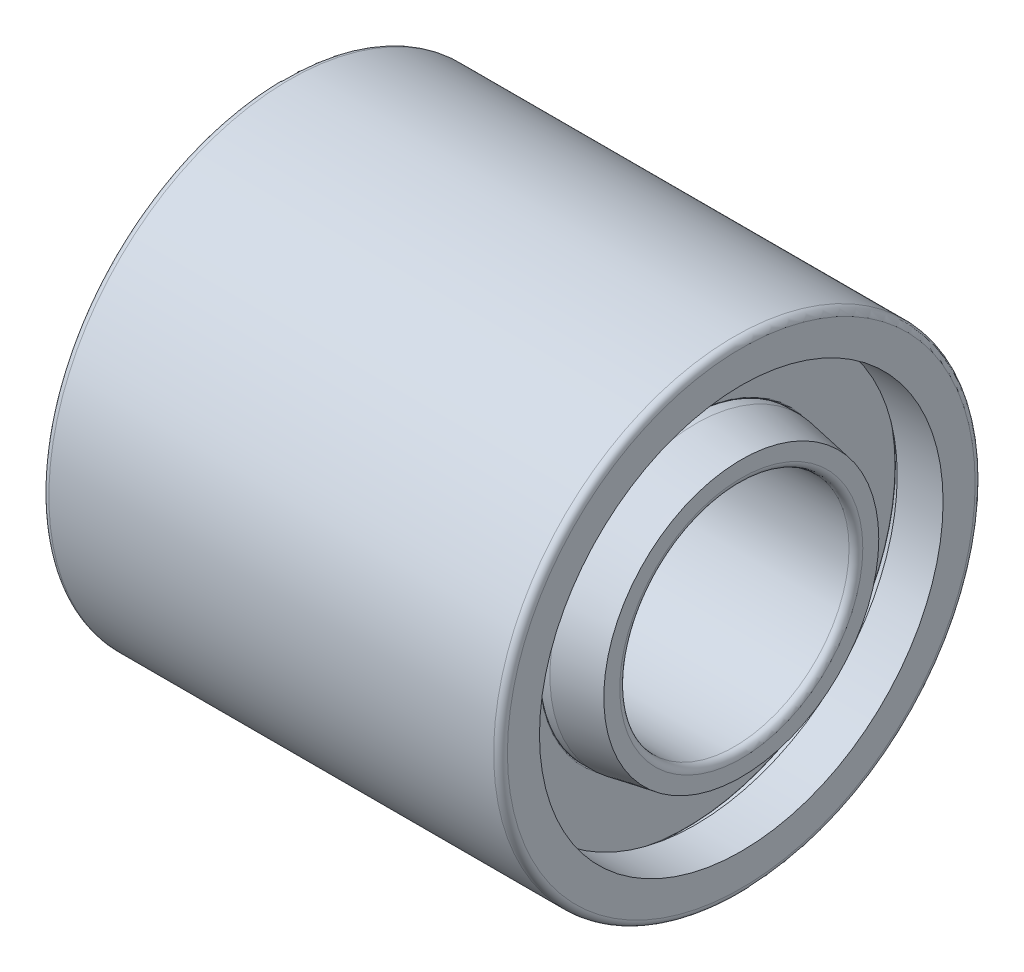
ISO-10303-21;
HEADER;
FILE_DESCRIPTION(('STEP AP214'),'2;1');
FILE_NAME('part.step','',(''),(''),'','','');
FILE_SCHEMA(('AUTOMOTIVE_DESIGN { 1 0 10303 214 1 1 1 1 }'));
ENDSEC;
DATA;
#1=APPLICATION_CONTEXT('core data for automotive mechanical design processes');
#2=APPLICATION_PROTOCOL_DEFINITION('international standard','automotive_design',2000,#1);
#3=PRODUCT_CONTEXT('',#1,'mechanical');
#4=PRODUCT('Part','Part','',(#3));
#5=PRODUCT_RELATED_PRODUCT_CATEGORY('part','',(#4));
#6=PRODUCT_DEFINITION_FORMATION('','',#4);
#7=PRODUCT_DEFINITION_CONTEXT('part definition',#1,'design');
#8=PRODUCT_DEFINITION('design','',#6,#7);
#9=PRODUCT_DEFINITION_SHAPE('','',#8);
#10=(LENGTH_UNIT() NAMED_UNIT(*) SI_UNIT(.MILLI.,.METRE.));
#11=(NAMED_UNIT(*) PLANE_ANGLE_UNIT() SI_UNIT($,.RADIAN.));
#12=(NAMED_UNIT(*) SI_UNIT($,.STERADIAN.) SOLID_ANGLE_UNIT());
#13=UNCERTAINTY_MEASURE_WITH_UNIT(LENGTH_MEASURE(1.E-05),#10,'distance_accuracy_value','');
#14=(GEOMETRIC_REPRESENTATION_CONTEXT(3) GLOBAL_UNCERTAINTY_ASSIGNED_CONTEXT((#13)) GLOBAL_UNIT_ASSIGNED_CONTEXT((#10,
#11,#12)) REPRESENTATION_CONTEXT('',''));
#15=CARTESIAN_POINT('',(0.,0.,0.));
#16=DIRECTION('',(0.,0.,1.));
#17=DIRECTION('',(1.,0.,0.));
#18=AXIS2_PLACEMENT_3D('',#15,#16,#17);
#19=CARTESIAN_POINT('',(-90.,0.,0.));
#20=DIRECTION('',(1.,0.,0.));
#21=DIRECTION('',(0.,0.,-1.));
#22=AXIS2_PLACEMENT_3D('',#19,#20,#21);
#23=CYLINDRICAL_SURFACE('',#22,18.305);
#24=CARTESIAN_POINT('',(-15.1207511689084,0.,0.));
#25=DIRECTION('',(1.,0.,0.));
#26=DIRECTION('',(0.,0.,-1.));
#27=AXIS2_PLACEMENT_3D('',#24,#25,#26);
#28=CIRCLE('',#27,18.305);
#29=CARTESIAN_POINT('',(-15.1207511689084,0.,-18.305));
#30=VERTEX_POINT('',#29);
#31=EDGE_CURVE('E44',#30,#30,#28,.F.);
#32=ORIENTED_EDGE('',*,*,#31,.F.);
#33=EDGE_LOOP('',(#32));
#34=FACE_BOUND('',#33,.T.);
#35=CARTESIAN_POINT('',(-16.,0.,0.));
#36=DIRECTION('',(1.,0.,0.));
#37=DIRECTION('',(0.,0.,-1.));
#38=AXIS2_PLACEMENT_3D('',#35,#36,#37);
#39=CIRCLE('',#38,18.305);
#40=CARTESIAN_POINT('',(-16.,0.,-18.305));
#41=VERTEX_POINT('',#40);
#42=EDGE_CURVE('E61',#41,#41,#39,.T.);
#43=ORIENTED_EDGE('',*,*,#42,.F.);
#44=EDGE_LOOP('',(#43));
#45=FACE_BOUND('',#44,.T.);
#46=ADVANCED_FACE('F32',(#34,#45),#23,.F.);
#47=CARTESIAN_POINT('',(-16.,18.305,0.));
#48=DIRECTION('',(1.,0.,0.));
#49=DIRECTION('',(0.,0.,-1.));
#50=AXIS2_PLACEMENT_3D('',#47,#48,#49);
#51=PLANE('',#50);
#52=ORIENTED_EDGE('',*,*,#42,.T.);
#53=EDGE_LOOP('',(#52));
#54=FACE_BOUND('',#53,.T.);
#55=CARTESIAN_POINT('',(-16.,0.,0.));
#56=DIRECTION('',(1.,0.,0.));
#57=DIRECTION('',(0.,0.,-1.));
#58=AXIS2_PLACEMENT_3D('',#55,#56,#57);
#59=CIRCLE('',#58,17.60375);
#60=CARTESIAN_POINT('',(-16.,0.,-17.60375));
#61=VERTEX_POINT('',#60);
#62=EDGE_CURVE('E88',#61,#61,#59,.T.);
#63=ORIENTED_EDGE('',*,*,#62,.F.);
#64=EDGE_LOOP('',(#63));
#65=FACE_BOUND('',#64,.T.);
#66=ADVANCED_FACE('F34',(#54,#65),#51,.T.);
#67=CARTESIAN_POINT('',(-90.,0.,0.));
#68=DIRECTION('',(1.,0.,0.));
#69=DIRECTION('',(0.,0.,-1.));
#70=AXIS2_PLACEMENT_3D('',#67,#68,#69);
#71=CYLINDRICAL_SURFACE('',#70,17.60375);
#72=ORIENTED_EDGE('',*,*,#62,.T.);
#73=EDGE_LOOP('',(#72));
#74=FACE_BOUND('',#73,.T.);
#75=CARTESIAN_POINT('',(-20.,0.,0.));
#76=DIRECTION('',(1.,0.,0.));
#77=DIRECTION('',(0.,0.,-1.));
#78=AXIS2_PLACEMENT_3D('',#75,#76,#77);
#79=CIRCLE('',#78,17.60375);
#80=CARTESIAN_POINT('',(-20.,0.,-17.60375));
#81=VERTEX_POINT('',#80);
#82=EDGE_CURVE('E85',#81,#81,#79,.T.);
#83=ORIENTED_EDGE('',*,*,#82,.F.);
#84=EDGE_LOOP('',(#83));
#85=FACE_BOUND('',#84,.T.);
#86=ADVANCED_FACE('F107',(#74,#85),#71,.F.);
#87=CARTESIAN_POINT('',(-20.,17.60375,0.));
#88=DIRECTION('',(-1.,0.,0.));
#89=DIRECTION('',(0.,0.,1.));
#90=AXIS2_PLACEMENT_3D('',#87,#88,#89);
#91=PLANE('',#90);
#92=ORIENTED_EDGE('',*,*,#82,.T.);
#93=EDGE_LOOP('',(#92));
#94=FACE_BOUND('',#93,.T.);
#95=CARTESIAN_POINT('',(-20.,0.,0.));
#96=DIRECTION('',(1.,0.,0.));
#97=DIRECTION('',(0.,0.,-1.));
#98=AXIS2_PLACEMENT_3D('',#95,#96,#97);
#99=CIRCLE('',#98,20.4);
#100=CARTESIAN_POINT('',(-20.,0.,-20.4));
#101=VERTEX_POINT('',#100);
#102=EDGE_CURVE('E82',#101,#101,#99,.T.);
#103=ORIENTED_EDGE('',*,*,#102,.F.);
#104=EDGE_LOOP('',(#103));
#105=FACE_BOUND('',#104,.T.);
#106=ADVANCED_FACE('F112',(#94,#105),#91,.T.);
#107=CARTESIAN_POINT('',(-19.4,0.,0.));
#108=DIRECTION('',(1.,0.,0.));
#109=DIRECTION('',(0.,0.,-1.));
#110=AXIS2_PLACEMENT_3D('',#107,#108,#109);
#111=TOROIDAL_SURFACE('',#110,20.4,0.600000000000002);
#112=ORIENTED_EDGE('',*,*,#102,.T.);
#113=EDGE_LOOP('',(#112));
#114=FACE_BOUND('',#113,.T.);
#115=CARTESIAN_POINT('',(-19.4,0.,0.));
#116=DIRECTION('',(1.,0.,0.));
#117=DIRECTION('',(0.,0.,-1.));
#118=AXIS2_PLACEMENT_3D('',#115,#116,#117);
#119=CIRCLE('',#118,21.);
#120=CARTESIAN_POINT('',(-19.4,0.,-21.));
#121=VERTEX_POINT('',#120);
#122=EDGE_CURVE('E79',#121,#121,#119,.T.);
#123=ORIENTED_EDGE('',*,*,#122,.F.);
#124=EDGE_LOOP('',(#123));
#125=FACE_BOUND('',#124,.T.);
#126=ADVANCED_FACE('F117',(#114,#125),#111,.T.);
#127=CARTESIAN_POINT('',(-90.,0.,0.));
#128=DIRECTION('',(1.,0.,0.));
#129=DIRECTION('',(0.,0.,-1.));
#130=AXIS2_PLACEMENT_3D('',#127,#128,#129);
#131=CYLINDRICAL_SURFACE('',#130,21.);
#132=ORIENTED_EDGE('',*,*,#122,.T.);
#133=EDGE_LOOP('',(#132));
#134=FACE_BOUND('',#133,.T.);
#135=CARTESIAN_POINT('',(19.4,0.,0.));
#136=DIRECTION('',(1.,0.,0.));
#137=DIRECTION('',(0.,0.,-1.));
#138=AXIS2_PLACEMENT_3D('',#135,#136,#137);
#139=CIRCLE('',#138,21.);
#140=CARTESIAN_POINT('',(19.4,0.,-21.));
#141=VERTEX_POINT('',#140);
#142=EDGE_CURVE('E76',#141,#141,#139,.T.);
#143=ORIENTED_EDGE('',*,*,#142,.F.);
#144=EDGE_LOOP('',(#143));
#145=FACE_BOUND('',#144,.T.);
#146=ADVANCED_FACE('F123',(#134,#145),#131,.T.);
#147=CARTESIAN_POINT('',(19.4,0.,0.));
#148=DIRECTION('',(1.,0.,0.));
#149=DIRECTION('',(0.,0.,-1.));
#150=AXIS2_PLACEMENT_3D('',#147,#148,#149);
#151=TOROIDAL_SURFACE('',#150,20.4,0.599999999999998);
#152=ORIENTED_EDGE('',*,*,#142,.T.);
#153=EDGE_LOOP('',(#152));
#154=FACE_BOUND('',#153,.T.);
#155=CARTESIAN_POINT('',(20.,0.,0.));
#156=DIRECTION('',(1.,0.,0.));
#157=DIRECTION('',(0.,0.,-1.));
#158=AXIS2_PLACEMENT_3D('',#155,#156,#157);
#159=CIRCLE('',#158,20.4);
#160=CARTESIAN_POINT('',(20.,0.,-20.4));
#161=VERTEX_POINT('',#160);
#162=EDGE_CURVE('E73',#161,#161,#159,.T.);
#163=ORIENTED_EDGE('',*,*,#162,.F.);
#164=EDGE_LOOP('',(#163));
#165=FACE_BOUND('',#164,.T.);
#166=ADVANCED_FACE('F129',(#154,#165),#151,.T.);
#167=CARTESIAN_POINT('',(20.,20.4,0.));
#168=DIRECTION('',(1.,0.,0.));
#169=DIRECTION('',(0.,0.,-1.));
#170=AXIS2_PLACEMENT_3D('',#167,#168,#169);
#171=PLANE('',#170);
#172=ORIENTED_EDGE('',*,*,#162,.T.);
#173=EDGE_LOOP('',(#172));
#174=FACE_BOUND('',#173,.T.);
#175=CARTESIAN_POINT('',(20.,0.,0.));
#176=DIRECTION('',(1.,0.,0.));
#177=DIRECTION('',(0.,0.,-1.));
#178=AXIS2_PLACEMENT_3D('',#175,#176,#177);
#179=CIRCLE('',#178,17.60375);
#180=CARTESIAN_POINT('',(20.,0.,-17.60375));
#181=VERTEX_POINT('',#180);
#182=EDGE_CURVE('E70',#181,#181,#179,.T.);
#183=ORIENTED_EDGE('',*,*,#182,.F.);
#184=EDGE_LOOP('',(#183));
#185=FACE_BOUND('',#184,.T.);
#186=ADVANCED_FACE('F135',(#174,#185),#171,.T.);
#187=CARTESIAN_POINT('',(-90.,0.,0.));
#188=DIRECTION('',(1.,0.,0.));
#189=DIRECTION('',(0.,0.,-1.));
#190=AXIS2_PLACEMENT_3D('',#187,#188,#189);
#191=CYLINDRICAL_SURFACE('',#190,17.60375);
#192=ORIENTED_EDGE('',*,*,#182,.T.);
#193=EDGE_LOOP('',(#192));
#194=FACE_BOUND('',#193,.T.);
#195=CARTESIAN_POINT('',(16.,0.,0.));
#196=DIRECTION('',(1.,0.,0.));
#197=DIRECTION('',(0.,0.,-1.));
#198=AXIS2_PLACEMENT_3D('',#195,#196,#197);
#199=CIRCLE('',#198,17.60375);
#200=CARTESIAN_POINT('',(16.,0.,-17.60375));
#201=VERTEX_POINT('',#200);
#202=EDGE_CURVE('E67',#201,#201,#199,.T.);
#203=ORIENTED_EDGE('',*,*,#202,.F.);
#204=EDGE_LOOP('',(#203));
#205=FACE_BOUND('',#204,.T.);
#206=ADVANCED_FACE('F141',(#194,#205),#191,.F.);
#207=CARTESIAN_POINT('',(16.,17.60375,0.));
#208=DIRECTION('',(-1.,0.,0.));
#209=DIRECTION('',(0.,0.,1.));
#210=AXIS2_PLACEMENT_3D('',#207,#208,#209);
#211=PLANE('',#210);
#212=ORIENTED_EDGE('',*,*,#202,.T.);
#213=EDGE_LOOP('',(#212));
#214=FACE_BOUND('',#213,.T.);
#215=CARTESIAN_POINT('',(16.,0.,0.));
#216=DIRECTION('',(1.,0.,0.));
#217=DIRECTION('',(0.,0.,-1.));
#218=AXIS2_PLACEMENT_3D('',#215,#216,#217);
#219=CIRCLE('',#218,18.305);
#220=CARTESIAN_POINT('',(16.,0.,-18.305));
#221=VERTEX_POINT('',#220);
#222=EDGE_CURVE('E64',#221,#221,#219,.T.);
#223=ORIENTED_EDGE('',*,*,#222,.F.);
#224=EDGE_LOOP('',(#223));
#225=FACE_BOUND('',#224,.T.);
#226=ADVANCED_FACE('F147',(#214,#225),#211,.T.);
#227=CARTESIAN_POINT('',(15.1207511689085,0.,0.));
#228=DIRECTION('',(-1.,0.,0.));
#229=DIRECTION('',(0.,0.,1.));
#230=AXIS2_PLACEMENT_3D('',#227,#228,#229);
#231=CIRCLE('',#230,18.305);
#232=CARTESIAN_POINT('',(15.1207511689085,0.,18.305));
#233=VERTEX_POINT('',#232);
#234=EDGE_CURVE('E91',#233,#233,#231,.F.);
#235=ORIENTED_EDGE('',*,*,#234,.F.);
#236=EDGE_LOOP('',(#235));
#237=FACE_BOUND('',#236,.T.);
#238=ORIENTED_EDGE('',*,*,#222,.T.);
#239=EDGE_LOOP('',(#238));
#240=FACE_BOUND('',#239,.T.);
#241=ADVANCED_FACE('F102',(#237,#240),#23,.F.);
#242=CARTESIAN_POINT('',(-15.0876,0.,0.));
#243=DIRECTION('',(1.,0.,0.));
#244=DIRECTION('',(0.,0.,-1.));
#245=AXIS2_PLACEMENT_3D('',#242,#243,#244);
#246=TOROIDAL_SURFACE('',#245,18.1976,0.112399999999993);
#247=ORIENTED_EDGE('',*,*,#31,.T.);
#248=EDGE_LOOP('',(#247));
#249=FACE_BOUND('',#248,.T.);
#250=CARTESIAN_POINT('',(-15.2,0.,0.));
#251=DIRECTION('',(1.,0.,0.));
#252=DIRECTION('',(0.,0.,-1.));
#253=AXIS2_PLACEMENT_3D('',#250,#251,#252);
#254=CIRCLE('',#253,18.1976);
#255=CARTESIAN_POINT('',(-15.2,0.,-18.1976));
#256=VERTEX_POINT('',#255);
#257=EDGE_CURVE('E58',#256,#256,#254,.T.);
#258=ORIENTED_EDGE('',*,*,#257,.T.);
#259=EDGE_LOOP('',(#258));
#260=FACE_BOUND('',#259,.T.);
#261=ADVANCED_FACE('F96',(#249,#260),#246,.T.);
#262=CARTESIAN_POINT('',(-15.2,18.1976,0.));
#263=DIRECTION('',(-1.,0.,0.));
#264=DIRECTION('',(0.,0.,1.));
#265=AXIS2_PLACEMENT_3D('',#262,#263,#264);
#266=PLANE('',#265);
#267=CARTESIAN_POINT('',(-15.2,0.,0.));
#268=DIRECTION('',(1.,0.,0.));
#269=DIRECTION('',(0.,0.,-1.));
#270=AXIS2_PLACEMENT_3D('',#267,#268,#269);
#271=CIRCLE('',#270,12.8024);
#272=CARTESIAN_POINT('',(-15.2,0.,-12.8024));
#273=VERTEX_POINT('',#272);
#274=EDGE_CURVE('E55',#273,#273,#271,.T.);
#275=ORIENTED_EDGE('',*,*,#274,.T.);
#276=EDGE_LOOP('',(#275));
#277=FACE_BOUND('',#276,.T.);
#278=ORIENTED_EDGE('',*,*,#257,.F.);
#279=EDGE_LOOP('',(#278));
#280=FACE_BOUND('',#279,.T.);
#281=ADVANCED_FACE('F161',(#277,#280),#266,.T.);
#282=CARTESIAN_POINT('',(-15.0876,0.,0.));
#283=DIRECTION('',(1.,0.,0.));
#284=DIRECTION('',(0.,0.,-1.));
#285=AXIS2_PLACEMENT_3D('',#282,#283,#284);
#286=TOROIDAL_SURFACE('',#285,12.8024,0.112399999999992);
#287=CARTESIAN_POINT('',(-15.1207511689085,0.,0.));
#288=DIRECTION('',(1.,0.,0.));
#289=DIRECTION('',(0.,0.,-1.));
#290=AXIS2_PLACEMENT_3D('',#287,#288,#289);
#291=CIRCLE('',#290,12.695);
#292=CARTESIAN_POINT('',(-15.1207511689085,0.,-12.695));
#293=VERTEX_POINT('',#292);
#294=EDGE_CURVE('E10',#293,#293,#291,.F.);
#295=ORIENTED_EDGE('',*,*,#294,.F.);
#296=EDGE_LOOP('',(#295));
#297=FACE_BOUND('',#296,.T.);
#298=ORIENTED_EDGE('',*,*,#274,.F.);
#299=EDGE_LOOP('',(#298));
#300=FACE_BOUND('',#299,.T.);
#301=ADVANCED_FACE('F167',(#297,#300),#286,.T.);
#302=CARTESIAN_POINT('',(15.0876,0.,0.));
#303=DIRECTION('',(1.,0.,0.));
#304=DIRECTION('',(0.,0.,-1.));
#305=AXIS2_PLACEMENT_3D('',#302,#303,#304);
#306=TOROIDAL_SURFACE('',#305,12.8024,0.112399999999993);
#307=CARTESIAN_POINT('',(15.1207511689085,0.,0.));
#308=DIRECTION('',(-1.,0.,0.));
#309=DIRECTION('',(0.,0.,1.));
#310=AXIS2_PLACEMENT_3D('',#307,#308,#309);
#311=CIRCLE('',#310,12.695);
#312=CARTESIAN_POINT('',(15.1207511689085,0.,12.695));
#313=VERTEX_POINT('',#312);
#314=EDGE_CURVE('E36',#313,#313,#311,.F.);
#315=ORIENTED_EDGE('',*,*,#314,.F.);
#316=EDGE_LOOP('',(#315));
#317=FACE_BOUND('',#316,.T.);
#318=CARTESIAN_POINT('',(15.2,0.,0.));
#319=DIRECTION('',(1.,0.,0.));
#320=DIRECTION('',(0.,0.,-1.));
#321=AXIS2_PLACEMENT_3D('',#318,#319,#320);
#322=CIRCLE('',#321,12.8024);
#323=CARTESIAN_POINT('',(15.2,0.,-12.8024));
#324=VERTEX_POINT('',#323);
#325=EDGE_CURVE('E52',#324,#324,#322,.T.);
#326=ORIENTED_EDGE('',*,*,#325,.T.);
#327=EDGE_LOOP('',(#326));
#328=FACE_BOUND('',#327,.T.);
#329=ADVANCED_FACE('F171',(#317,#328),#306,.T.);
#330=CARTESIAN_POINT('',(15.2,12.8024,0.));
#331=DIRECTION('',(1.,0.,0.));
#332=DIRECTION('',(0.,0.,-1.));
#333=AXIS2_PLACEMENT_3D('',#330,#331,#332);
#334=PLANE('',#333);
#335=CARTESIAN_POINT('',(15.2,0.,0.));
#336=DIRECTION('',(1.,0.,0.));
#337=DIRECTION('',(0.,0.,-1.));
#338=AXIS2_PLACEMENT_3D('',#335,#336,#337);
#339=CIRCLE('',#338,18.1976);
#340=CARTESIAN_POINT('',(15.2,0.,-18.1976));
#341=VERTEX_POINT('',#340);
#342=EDGE_CURVE('E49',#341,#341,#339,.T.);
#343=ORIENTED_EDGE('',*,*,#342,.T.);
#344=EDGE_LOOP('',(#343));
#345=FACE_BOUND('',#344,.T.);
#346=ORIENTED_EDGE('',*,*,#325,.F.);
#347=EDGE_LOOP('',(#346));
#348=FACE_BOUND('',#347,.T.);
#349=ADVANCED_FACE('F175',(#345,#348),#334,.T.);
#350=CARTESIAN_POINT('',(15.0876,0.,0.));
#351=DIRECTION('',(1.,0.,0.));
#352=DIRECTION('',(0.,0.,-1.));
#353=AXIS2_PLACEMENT_3D('',#350,#351,#352);
#354=TOROIDAL_SURFACE('',#353,18.1976,0.112399999999999);
#355=ORIENTED_EDGE('',*,*,#234,.T.);
#356=EDGE_LOOP('',(#355));
#357=FACE_BOUND('',#356,.T.);
#358=ORIENTED_EDGE('',*,*,#342,.F.);
#359=EDGE_LOOP('',(#358));
#360=FACE_BOUND('',#359,.T.);
#361=ADVANCED_FACE('F179',(#357,#360),#354,.T.);
#362=CARTESIAN_POINT('',(-90.,0.,0.));
#363=DIRECTION('',(1.,0.,0.));
#364=DIRECTION('',(0.,0.,-1.));
#365=AXIS2_PLACEMENT_3D('',#362,#363,#364);
#366=CYLINDRICAL_SURFACE('',#365,12.695);
#367=ORIENTED_EDGE('',*,*,#294,.T.);
#368=EDGE_LOOP('',(#367));
#369=FACE_BOUND('',#368,.T.);
#370=CARTESIAN_POINT('',(-16.,0.,0.));
#371=DIRECTION('',(1.,0.,0.));
#372=DIRECTION('',(0.,0.,-1.));
#373=AXIS2_PLACEMENT_3D('',#370,#371,#372);
#374=CIRCLE('',#373,12.695);
#375=CARTESIAN_POINT('',(-16.,0.,-12.695));
#376=VERTEX_POINT('',#375);
#377=EDGE_CURVE('E47',#376,#376,#374,.T.);
#378=ORIENTED_EDGE('',*,*,#377,.T.);
#379=EDGE_LOOP('',(#378));
#380=FACE_BOUND('',#379,.T.);
#381=ADVANCED_FACE('F183',(#369,#380),#366,.T.);
#382=ORIENTED_EDGE('',*,*,#314,.T.);
#383=EDGE_LOOP('',(#382));
#384=FACE_BOUND('',#383,.T.);
#385=CARTESIAN_POINT('',(16.,0.,0.));
#386=DIRECTION('',(1.,0.,0.));
#387=DIRECTION('',(0.,0.,-1.));
#388=AXIS2_PLACEMENT_3D('',#385,#386,#387);
#389=CIRCLE('',#388,12.695);
#390=CARTESIAN_POINT('',(16.,0.,-12.695));
#391=VERTEX_POINT('',#390);
#392=EDGE_CURVE('E221',#391,#391,#389,.T.);
#393=ORIENTED_EDGE('',*,*,#392,.F.);
#394=EDGE_LOOP('',(#393));
#395=FACE_BOUND('',#394,.T.);
#396=ADVANCED_FACE('F185',(#384,#395),#366,.T.);
#397=CARTESIAN_POINT('',(-16.,0.,0.));
#398=DIRECTION('',(1.,0.,0.));
#399=DIRECTION('',(0.,0.,-1.));
#400=AXIS2_PLACEMENT_3D('',#397,#398,#399);
#401=CONICAL_SURFACE('',#400,12.695,0.173548864423775);
#402=CARTESIAN_POINT('',(-20.,0.,0.));
#403=DIRECTION('',(1.,0.,0.));
#404=DIRECTION('',(0.,0.,-1.));
#405=AXIS2_PLACEMENT_3D('',#402,#403,#404);
#406=CIRCLE('',#405,11.99375);
#407=CARTESIAN_POINT('',(-20.,0.,-11.99375));
#408=VERTEX_POINT('',#407);
#409=EDGE_CURVE('E239',#408,#408,#406,.T.);
#410=ORIENTED_EDGE('',*,*,#409,.T.);
#411=EDGE_LOOP('',(#410));
#412=FACE_BOUND('',#411,.T.);
#413=ORIENTED_EDGE('',*,*,#377,.F.);
#414=EDGE_LOOP('',(#413));
#415=FACE_BOUND('',#414,.T.);
#416=ADVANCED_FACE('F188',(#412,#415),#401,.T.);
#417=CARTESIAN_POINT('',(-20.,11.99375,0.));
#418=DIRECTION('',(-1.,0.,0.));
#419=DIRECTION('',(0.,0.,1.));
#420=AXIS2_PLACEMENT_3D('',#417,#418,#419);
#421=PLANE('',#420);
#422=CARTESIAN_POINT('',(-20.,0.,0.));
#423=DIRECTION('',(1.,0.,0.));
#424=DIRECTION('',(0.,0.,-1.));
#425=AXIS2_PLACEMENT_3D('',#422,#423,#424);
#426=CIRCLE('',#425,10.6);
#427=CARTESIAN_POINT('',(-20.,0.,-10.6));
#428=VERTEX_POINT('',#427);
#429=EDGE_CURVE('E237',#428,#428,#426,.T.);
#430=ORIENTED_EDGE('',*,*,#429,.T.);
#431=EDGE_LOOP('',(#430));
#432=FACE_BOUND('',#431,.T.);
#433=ORIENTED_EDGE('',*,*,#409,.F.);
#434=EDGE_LOOP('',(#433));
#435=FACE_BOUND('',#434,.T.);
#436=ADVANCED_FACE('F192',(#432,#435),#421,.T.);
#437=CARTESIAN_POINT('',(-19.4,0.,0.));
#438=DIRECTION('',(1.,0.,0.));
#439=DIRECTION('',(0.,0.,-1.));
#440=AXIS2_PLACEMENT_3D('',#437,#438,#439);
#441=TOROIDAL_SURFACE('',#440,10.6,0.600000000000001);
#442=CARTESIAN_POINT('',(-19.4,0.,0.));
#443=DIRECTION('',(1.,0.,0.));
#444=DIRECTION('',(0.,0.,-1.));
#445=AXIS2_PLACEMENT_3D('',#442,#443,#444);
#446=CIRCLE('',#445,10.);
#447=CARTESIAN_POINT('',(-19.4,0.,-10.));
#448=VERTEX_POINT('',#447);
#449=EDGE_CURVE('E234',#448,#448,#446,.T.);
#450=ORIENTED_EDGE('',*,*,#449,.T.);
#451=EDGE_LOOP('',(#450));
#452=FACE_BOUND('',#451,.T.);
#453=ORIENTED_EDGE('',*,*,#429,.F.);
#454=EDGE_LOOP('',(#453));
#455=FACE_BOUND('',#454,.T.);
#456=ADVANCED_FACE('F196',(#452,#455),#441,.T.);
#457=CARTESIAN_POINT('',(-90.,0.,0.));
#458=DIRECTION('',(1.,0.,0.));
#459=DIRECTION('',(0.,0.,-1.));
#460=AXIS2_PLACEMENT_3D('',#457,#458,#459);
#461=CYLINDRICAL_SURFACE('',#460,10.);
#462=CARTESIAN_POINT('',(19.4,0.,0.));
#463=DIRECTION('',(1.,0.,0.));
#464=DIRECTION('',(0.,0.,-1.));
#465=AXIS2_PLACEMENT_3D('',#462,#463,#464);
#466=CIRCLE('',#465,10.);
#467=CARTESIAN_POINT('',(19.4,0.,-10.));
#468=VERTEX_POINT('',#467);
#469=EDGE_CURVE('E228',#468,#468,#466,.T.);
#470=ORIENTED_EDGE('',*,*,#469,.T.);
#471=EDGE_LOOP('',(#470));
#472=FACE_BOUND('',#471,.T.);
#473=ORIENTED_EDGE('',*,*,#449,.F.);
#474=EDGE_LOOP('',(#473));
#475=FACE_BOUND('',#474,.T.);
#476=ADVANCED_FACE('F200',(#472,#475),#461,.F.);
#477=CARTESIAN_POINT('',(19.4,0.,0.));
#478=DIRECTION('',(1.,0.,0.));
#479=DIRECTION('',(0.,0.,-1.));
#480=AXIS2_PLACEMENT_3D('',#477,#478,#479);
#481=TOROIDAL_SURFACE('',#480,10.6,0.6);
#482=CARTESIAN_POINT('',(20.,0.,0.));
#483=DIRECTION('',(1.,0.,0.));
#484=DIRECTION('',(0.,0.,-1.));
#485=AXIS2_PLACEMENT_3D('',#482,#483,#484);
#486=CIRCLE('',#485,10.6);
#487=CARTESIAN_POINT('',(20.,0.,-10.6));
#488=VERTEX_POINT('',#487);
#489=EDGE_CURVE('E225',#488,#488,#486,.T.);
#490=ORIENTED_EDGE('',*,*,#489,.T.);
#491=EDGE_LOOP('',(#490));
#492=FACE_BOUND('',#491,.T.);
#493=ORIENTED_EDGE('',*,*,#469,.F.);
#494=EDGE_LOOP('',(#493));
#495=FACE_BOUND('',#494,.T.);
#496=ADVANCED_FACE('F204',(#492,#495),#481,.T.);
#497=CARTESIAN_POINT('',(20.,10.6,0.));
#498=DIRECTION('',(1.,0.,0.));
#499=DIRECTION('',(0.,0.,-1.));
#500=AXIS2_PLACEMENT_3D('',#497,#498,#499);
#501=PLANE('',#500);
#502=CARTESIAN_POINT('',(20.,0.,0.));
#503=DIRECTION('',(1.,0.,0.));
#504=DIRECTION('',(0.,0.,-1.));
#505=AXIS2_PLACEMENT_3D('',#502,#503,#504);
#506=CIRCLE('',#505,11.99375);
#507=CARTESIAN_POINT('',(20.,0.,-11.99375));
#508=VERTEX_POINT('',#507);
#509=EDGE_CURVE('E224',#508,#508,#506,.T.);
#510=ORIENTED_EDGE('',*,*,#509,.T.);
#511=EDGE_LOOP('',(#510));
#512=FACE_BOUND('',#511,.T.);
#513=ORIENTED_EDGE('',*,*,#489,.F.);
#514=EDGE_LOOP('',(#513));
#515=FACE_BOUND('',#514,.T.);
#516=ADVANCED_FACE('F208',(#512,#515),#501,.T.);
#517=CARTESIAN_POINT('',(20.,0.,0.));
#518=DIRECTION('',(-1.,0.,0.));
#519=DIRECTION('',(0.,0.,1.));
#520=AXIS2_PLACEMENT_3D('',#517,#518,#519);
#521=CONICAL_SURFACE('',#520,11.99375,0.173548864423785);
#522=ORIENTED_EDGE('',*,*,#392,.T.);
#523=EDGE_LOOP('',(#522));
#524=FACE_BOUND('',#523,.T.);
#525=ORIENTED_EDGE('',*,*,#509,.F.);
#526=EDGE_LOOP('',(#525));
#527=FACE_BOUND('',#526,.T.);
#528=ADVANCED_FACE('F212',(#524,#527),#521,.T.);
#529=CLOSED_SHELL('',(#46,#66,#86,#106,#126,#146,#166,#186,#206,#226,#241,#261,#281,#301,#329,
#349,#361,#381,#396,#416,#436,#456,#476,#496,#516,#528));
#530=MANIFOLD_SOLID_BREP('B2',#529);
#531=ADVANCED_BREP_SHAPE_REPRESENTATION('',(#18,#530),#14);
#532=SHAPE_DEFINITION_REPRESENTATION(#9,#531);
ENDSEC;
END-ISO-10303-21;
